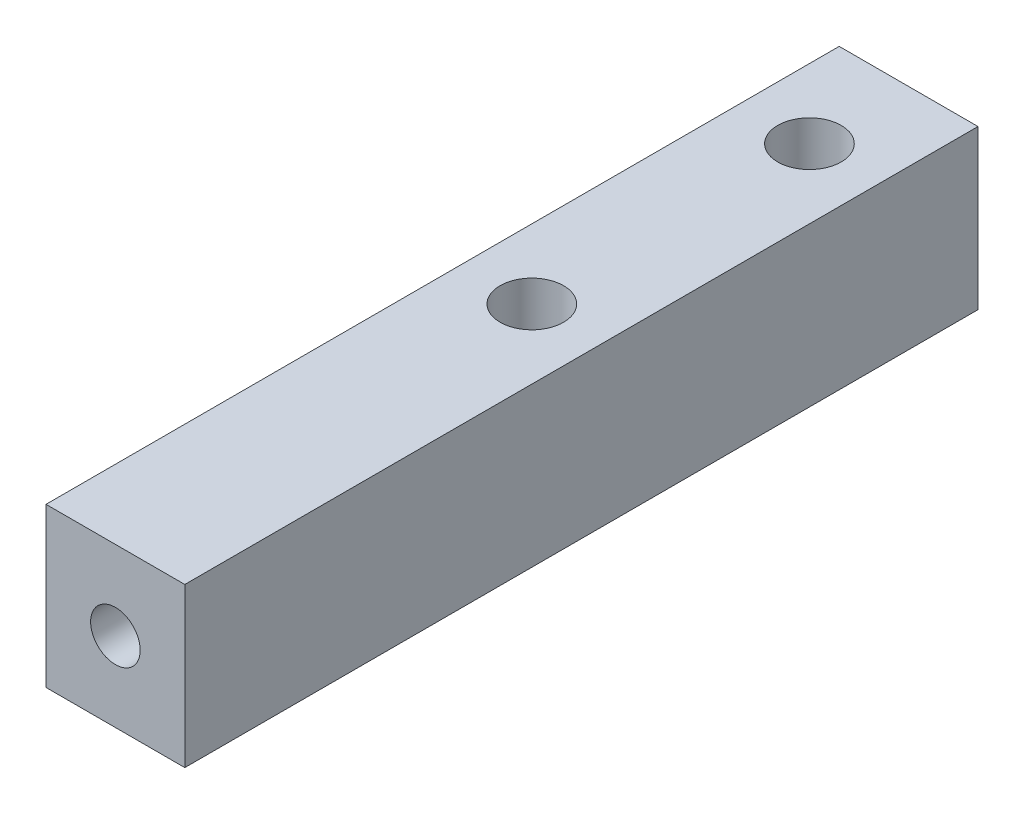
ISO-10303-21;
HEADER;
FILE_DESCRIPTION(('STEP AP214'),'2;1');
FILE_NAME('part.step','',(''),(''),'','','');
FILE_SCHEMA(('AUTOMOTIVE_DESIGN { 1 0 10303 214 1 1 1 1 }'));
ENDSEC;
DATA;
#1=APPLICATION_CONTEXT('core data for automotive mechanical design processes');
#2=APPLICATION_PROTOCOL_DEFINITION('international standard','automotive_design',2000,#1);
#3=PRODUCT_CONTEXT('',#1,'mechanical');
#4=PRODUCT('Part','Part','',(#3));
#5=PRODUCT_RELATED_PRODUCT_CATEGORY('part','',(#4));
#6=PRODUCT_DEFINITION_FORMATION('','',#4);
#7=PRODUCT_DEFINITION_CONTEXT('part definition',#1,'design');
#8=PRODUCT_DEFINITION('design','',#6,#7);
#9=PRODUCT_DEFINITION_SHAPE('','',#8);
#10=(LENGTH_UNIT() NAMED_UNIT(*) SI_UNIT(.MILLI.,.METRE.));
#11=(NAMED_UNIT(*) PLANE_ANGLE_UNIT() SI_UNIT($,.RADIAN.));
#12=(NAMED_UNIT(*) SI_UNIT($,.STERADIAN.) SOLID_ANGLE_UNIT());
#13=UNCERTAINTY_MEASURE_WITH_UNIT(LENGTH_MEASURE(1.E-05),#10,'distance_accuracy_value','');
#14=(GEOMETRIC_REPRESENTATION_CONTEXT(3) GLOBAL_UNCERTAINTY_ASSIGNED_CONTEXT((#13)) GLOBAL_UNIT_ASSIGNED_CONTEXT((#10,
#11,#12)) REPRESENTATION_CONTEXT('',''));
#15=CARTESIAN_POINT('',(0.,0.,0.));
#16=DIRECTION('',(0.,0.,1.));
#17=DIRECTION('',(1.,0.,0.));
#18=AXIS2_PLACEMENT_3D('',#15,#16,#17);
#19=CARTESIAN_POINT('',(0.,0.,40.));
#20=DIRECTION('',(1.,0.,0.));
#21=DIRECTION('',(0.,1.,0.));
#22=AXIS2_PLACEMENT_3D('',#19,#20,#21);
#23=PLANE('',#22);
#24=DIRECTION('',(0.,-1.,0.));
#25=VECTOR('',#24,1.);
#26=CARTESIAN_POINT('',(0.,0.,0.));
#27=LINE('',#26,#25);
#28=CARTESIAN_POINT('',(0.,8.,0.));
#29=VERTEX_POINT('',#28);
#30=CARTESIAN_POINT('',(0.,0.,0.));
#31=VERTEX_POINT('',#30);
#32=EDGE_CURVE('E103',#29,#31,#27,.T.);
#33=ORIENTED_EDGE('',*,*,#32,.T.);
#34=DIRECTION('',(0.,0.,-1.));
#35=VECTOR('',#34,1.);
#36=CARTESIAN_POINT('',(0.,0.,40.));
#37=LINE('',#36,#35);
#38=CARTESIAN_POINT('',(0.,0.,40.));
#39=VERTEX_POINT('',#38);
#40=EDGE_CURVE('E11',#39,#31,#37,.T.);
#41=ORIENTED_EDGE('',*,*,#40,.F.);
#42=DIRECTION('',(0.,-1.,0.));
#43=VECTOR('',#42,1.);
#44=CARTESIAN_POINT('',(0.,0.,40.));
#45=LINE('',#44,#43);
#46=CARTESIAN_POINT('',(0.,8.,40.));
#47=VERTEX_POINT('',#46);
#48=EDGE_CURVE('E114',#47,#39,#45,.T.);
#49=ORIENTED_EDGE('',*,*,#48,.F.);
#50=DIRECTION('',(0.,0.,-1.));
#51=VECTOR('',#50,1.);
#52=CARTESIAN_POINT('',(0.,8.,40.));
#53=LINE('',#52,#51);
#54=EDGE_CURVE('E119',#47,#29,#53,.T.);
#55=ORIENTED_EDGE('',*,*,#54,.T.);
#56=EDGE_LOOP('',(#33,#41,#49,#55));
#57=FACE_BOUND('',#56,.T.);
#58=ADVANCED_FACE('F36',(#57),#23,.F.);
#59=CARTESIAN_POINT('',(0.,0.,40.));
#60=DIRECTION('',(0.,1.,0.));
#61=DIRECTION('',(0.,0.,1.));
#62=AXIS2_PLACEMENT_3D('',#59,#60,#61);
#63=PLANE('',#62);
#64=CARTESIAN_POINT('',(3.5,0.,19.));
#65=DIRECTION('',(0.,1.,0.));
#66=DIRECTION('',(0.,0.,1.));
#67=AXIS2_PLACEMENT_3D('',#64,#65,#66);
#68=CIRCLE('',#67,1.59999999999999);
#69=CARTESIAN_POINT('',(3.5,0.,20.6));
#70=VERTEX_POINT('',#69);
#71=EDGE_CURVE('E131',#70,#70,#68,.T.);
#72=ORIENTED_EDGE('',*,*,#71,.T.);
#73=EDGE_LOOP('',(#72));
#74=FACE_BOUND('',#73,.T.);
#75=CARTESIAN_POINT('',(3.5,0.,5.));
#76=DIRECTION('',(0.,1.,0.));
#77=DIRECTION('',(0.,0.,1.));
#78=AXIS2_PLACEMENT_3D('',#75,#76,#77);
#79=CIRCLE('',#78,1.6);
#80=CARTESIAN_POINT('',(3.5,0.,6.6));
#81=VERTEX_POINT('',#80);
#82=EDGE_CURVE('E110',#81,#81,#79,.T.);
#83=ORIENTED_EDGE('',*,*,#82,.T.);
#84=EDGE_LOOP('',(#83));
#85=FACE_BOUND('',#84,.T.);
#86=DIRECTION('',(1.,0.,0.));
#87=VECTOR('',#86,1.);
#88=CARTESIAN_POINT('',(0.,0.,0.));
#89=LINE('',#88,#87);
#90=CARTESIAN_POINT('',(7.,0.,0.));
#91=VERTEX_POINT('',#90);
#92=EDGE_CURVE('E107',#31,#91,#89,.T.);
#93=ORIENTED_EDGE('',*,*,#92,.T.);
#94=DIRECTION('',(0.,0.,-1.));
#95=VECTOR('',#94,1.);
#96=CARTESIAN_POINT('',(7.,0.,40.));
#97=LINE('',#96,#95);
#98=CARTESIAN_POINT('',(7.,0.,40.));
#99=VERTEX_POINT('',#98);
#100=EDGE_CURVE('E49',#99,#91,#97,.T.);
#101=ORIENTED_EDGE('',*,*,#100,.F.);
#102=DIRECTION('',(1.,0.,0.));
#103=VECTOR('',#102,1.);
#104=CARTESIAN_POINT('',(0.,0.,40.));
#105=LINE('',#104,#103);
#106=EDGE_CURVE('E89',#39,#99,#105,.T.);
#107=ORIENTED_EDGE('',*,*,#106,.F.);
#108=ORIENTED_EDGE('',*,*,#40,.T.);
#109=EDGE_LOOP('',(#93,#101,#107,#108));
#110=FACE_BOUND('',#109,.T.);
#111=ADVANCED_FACE('F150',(#74,#85,#110),#63,.F.);
#112=CARTESIAN_POINT('',(7.,0.,40.));
#113=DIRECTION('',(-1.,0.,0.));
#114=DIRECTION('',(0.,-1.,0.));
#115=AXIS2_PLACEMENT_3D('',#112,#113,#114);
#116=PLANE('',#115);
#117=DIRECTION('',(0.,1.,0.));
#118=VECTOR('',#117,1.);
#119=CARTESIAN_POINT('',(7.,0.,0.));
#120=LINE('',#119,#118);
#121=CARTESIAN_POINT('',(7.,8.,0.));
#122=VERTEX_POINT('',#121);
#123=EDGE_CURVE('E76',#91,#122,#120,.T.);
#124=ORIENTED_EDGE('',*,*,#123,.T.);
#125=DIRECTION('',(0.,0.,-1.));
#126=VECTOR('',#125,1.);
#127=CARTESIAN_POINT('',(7.,8.,40.));
#128=LINE('',#127,#126);
#129=CARTESIAN_POINT('',(7.,8.,40.));
#130=VERTEX_POINT('',#129);
#131=EDGE_CURVE('E125',#130,#122,#128,.T.);
#132=ORIENTED_EDGE('',*,*,#131,.F.);
#133=DIRECTION('',(0.,1.,0.));
#134=VECTOR('',#133,1.);
#135=CARTESIAN_POINT('',(7.,0.,40.));
#136=LINE('',#135,#134);
#137=EDGE_CURVE('E117',#99,#130,#136,.T.);
#138=ORIENTED_EDGE('',*,*,#137,.F.);
#139=ORIENTED_EDGE('',*,*,#100,.T.);
#140=EDGE_LOOP('',(#124,#132,#138,#139));
#141=FACE_BOUND('',#140,.T.);
#142=ADVANCED_FACE('F155',(#141),#116,.F.);
#143=CARTESIAN_POINT('',(0.,8.,40.));
#144=DIRECTION('',(0.,-1.,0.));
#145=DIRECTION('',(0.,0.,-1.));
#146=AXIS2_PLACEMENT_3D('',#143,#144,#145);
#147=PLANE('',#146);
#148=CARTESIAN_POINT('',(3.5,8.,19.));
#149=DIRECTION('',(0.,1.,0.));
#150=DIRECTION('',(0.,0.,1.));
#151=AXIS2_PLACEMENT_3D('',#148,#149,#150);
#152=CIRCLE('',#151,1.59999999999999);
#153=CARTESIAN_POINT('',(3.5,8.,20.6));
#154=VERTEX_POINT('',#153);
#155=EDGE_CURVE('E240',#154,#154,#152,.T.);
#156=ORIENTED_EDGE('',*,*,#155,.F.);
#157=EDGE_LOOP('',(#156));
#158=FACE_BOUND('',#157,.T.);
#159=CARTESIAN_POINT('',(3.5,8.,5.));
#160=DIRECTION('',(0.,1.,0.));
#161=DIRECTION('',(0.,0.,1.));
#162=AXIS2_PLACEMENT_3D('',#159,#160,#161);
#163=CIRCLE('',#162,1.6);
#164=CARTESIAN_POINT('',(3.5,8.,6.6));
#165=VERTEX_POINT('',#164);
#166=EDGE_CURVE('E234',#165,#165,#163,.T.);
#167=ORIENTED_EDGE('',*,*,#166,.F.);
#168=EDGE_LOOP('',(#167));
#169=FACE_BOUND('',#168,.T.);
#170=DIRECTION('',(-1.,0.,0.));
#171=VECTOR('',#170,1.);
#172=CARTESIAN_POINT('',(0.,8.,0.));
#173=LINE('',#172,#171);
#174=EDGE_CURVE('E82',#122,#29,#173,.T.);
#175=ORIENTED_EDGE('',*,*,#174,.T.);
#176=ORIENTED_EDGE('',*,*,#54,.F.);
#177=DIRECTION('',(-1.,0.,0.));
#178=VECTOR('',#177,1.);
#179=CARTESIAN_POINT('',(0.,8.,40.));
#180=LINE('',#179,#178);
#181=EDGE_CURVE('E58',#130,#47,#180,.T.);
#182=ORIENTED_EDGE('',*,*,#181,.F.);
#183=ORIENTED_EDGE('',*,*,#131,.T.);
#184=EDGE_LOOP('',(#175,#176,#182,#183));
#185=FACE_BOUND('',#184,.T.);
#186=ADVANCED_FACE('F164',(#158,#169,#185),#147,.F.);
#187=CARTESIAN_POINT('',(0.,0.,40.));
#188=DIRECTION('',(0.,0.,-1.));
#189=DIRECTION('',(-1.,0.,0.));
#190=AXIS2_PLACEMENT_3D('',#187,#188,#189);
#191=PLANE('',#190);
#192=CARTESIAN_POINT('',(3.5,4.,40.));
#193=DIRECTION('',(0.,0.,1.));
#194=DIRECTION('',(1.,0.,0.));
#195=AXIS2_PLACEMENT_3D('',#192,#193,#194);
#196=CIRCLE('',#195,1.24999999999999);
#197=CARTESIAN_POINT('',(4.74999999999999,4.,40.));
#198=VERTEX_POINT('',#197);
#199=EDGE_CURVE('E104',#198,#198,#196,.T.);
#200=ORIENTED_EDGE('',*,*,#199,.F.);
#201=EDGE_LOOP('',(#200));
#202=FACE_BOUND('',#201,.T.);
#203=ORIENTED_EDGE('',*,*,#48,.T.);
#204=ORIENTED_EDGE('',*,*,#106,.T.);
#205=ORIENTED_EDGE('',*,*,#137,.T.);
#206=ORIENTED_EDGE('',*,*,#181,.T.);
#207=EDGE_LOOP('',(#203,#204,#205,#206));
#208=FACE_BOUND('',#207,.T.);
#209=ADVANCED_FACE('F162',(#202,#208),#191,.F.);
#210=CARTESIAN_POINT('',(0.,0.,0.));
#211=DIRECTION('',(0.,0.,-1.));
#212=DIRECTION('',(-1.,0.,0.));
#213=AXIS2_PLACEMENT_3D('',#210,#211,#212);
#214=PLANE('',#213);
#215=ORIENTED_EDGE('',*,*,#32,.F.);
#216=ORIENTED_EDGE('',*,*,#174,.F.);
#217=ORIENTED_EDGE('',*,*,#123,.F.);
#218=ORIENTED_EDGE('',*,*,#92,.F.);
#219=EDGE_LOOP('',(#215,#216,#217,#218));
#220=FACE_BOUND('',#219,.T.);
#221=ADVANCED_FACE('F145',(#220),#214,.T.);
#222=CARTESIAN_POINT('',(3.5,4.,40.));
#223=DIRECTION('',(0.,0.,1.));
#224=DIRECTION('',(1.,0.,0.));
#225=AXIS2_PLACEMENT_3D('',#222,#223,#224);
#226=CYLINDRICAL_SURFACE('',#225,1.24999999999998);
#227=CARTESIAN_POINT('',(4.74999999999998,4.,19.9987492177719));
#228=CARTESIAN_POINT('',(4.74999905834347,3.94277264857878,19.99875126594));
#229=CARTESIAN_POINT('',(4.7460206912253,3.88554133434749,20.0037895333303));
#230=CARTESIAN_POINT('',(4.73061486703399,3.77346523580345,20.0226053436358));
#231=CARTESIAN_POINT('',(4.71915588792606,3.71863160290557,20.0364198615448));
#232=CARTESIAN_POINT('',(4.68649982329251,3.60094587776204,20.073755770139));
#233=CARTESIAN_POINT('',(4.66370069342188,3.53903352197925,20.0987550336182));
#234=CARTESIAN_POINT('',(4.60979033563244,3.42114026043416,20.1531860293846));
#235=CARTESIAN_POINT('',(4.57866947395732,3.36516633494094,20.1826228815613));
#236=CARTESIAN_POINT('',(4.50774651870661,3.25756416366948,20.2436644502534));
#237=CARTESIAN_POINT('',(4.46772446225539,3.20610287120465,20.2753068838967));
#238=CARTESIAN_POINT('',(4.37981362614421,3.10967534406935,20.3374699939015));
#239=CARTESIAN_POINT('',(4.33193074436396,3.06470428703142,20.3679914904375));
#240=CARTESIAN_POINT('',(4.23081316825098,2.98392677380107,20.4244695284012));
#241=CARTESIAN_POINT('',(4.1779199341312,2.94779704540854,20.4505703709265));
#242=CARTESIAN_POINT('',(4.06556534785833,2.88339121161827,20.4979452513442));
#243=CARTESIAN_POINT('',(4.00611034569166,2.85510760488701,20.5192238959399));
#244=CARTESIAN_POINT('',(3.89128397905924,2.81148543843634,20.5523851173472));
#245=CARTESIAN_POINT('',(3.83669006025766,2.79482522222786,20.565209301113));
#246=CARTESIAN_POINT('',(3.72474539873686,2.76903228734458,20.5851542072672));
#247=CARTESIAN_POINT('',(3.66739647953748,2.75989466022647,20.5922786486169));
#248=CARTESIAN_POINT('',(3.55136434702235,2.74969498714826,20.6002350511513));
#249=CARTESIAN_POINT('',(3.49267762905087,2.74865739741446,20.6010479560426));
#250=CARTESIAN_POINT('',(3.37600025053518,2.75479408494118,20.5962562992692));
#251=CARTESIAN_POINT('',(3.31800968239315,2.7619694404159,20.5906508949941));
#252=CARTESIAN_POINT('',(3.20707028780574,2.78355351637801,20.5739118524586));
#253=CARTESIAN_POINT('',(3.15401218810584,2.79761603874161,20.5630430572395));
#254=CARTESIAN_POINT('',(3.05122809224261,2.83207659944447,20.5366919297513));
#255=CARTESIAN_POINT('',(3.00150288795745,2.85247613698304,20.5212085057972));
#256=CARTESIAN_POINT('',(2.90118080521289,2.90120971742196,20.4847729469328));
#257=CARTESIAN_POINT('',(2.85102411787677,2.93014556422365,20.4634212071875));
#258=CARTESIAN_POINT('',(2.75613496465724,2.99380188704757,20.4175498418317));
#259=CARTESIAN_POINT('',(2.71140625417985,3.02852632898923,20.3930280469365));
#260=CARTESIAN_POINT('',(2.61902263264094,3.11064995398226,20.3369227709444));
#261=CARTESIAN_POINT('',(2.57263675186475,3.15918924636873,20.3049200793009));
#262=CARTESIAN_POINT('',(2.48820266919998,3.26294629156026,20.2405968117025));
#263=CARTESIAN_POINT('',(2.45016217556052,3.31817014615378,20.2082759704325));
#264=CARTESIAN_POINT('',(2.38795571136045,3.42629431248143,20.1510275976312));
#265=CARTESIAN_POINT('',(2.36256188013346,3.47828530221923,20.1257207918353));
#266=CARTESIAN_POINT('',(2.31874932286463,3.58700494559874,20.0796549739323));
#267=CARTESIAN_POINT('',(2.30031508682184,3.64372271645399,20.0588858932277));
#268=CARTESIAN_POINT('',(2.27515761390896,3.74643408616934,20.029581449128));
#269=CARTESIAN_POINT('',(2.26664627350971,3.79147044501236,20.0192766529645));
#270=CARTESIAN_POINT('',(2.25462244664553,3.88312016388621,20.0045541766943));
#271=CARTESIAN_POINT('',(2.25110070906747,3.92973044096572,20.0001256025836));
#272=CARTESIAN_POINT('',(2.24933910484537,4.02337722146857,19.9979231668751));
#273=CARTESIAN_POINT('',(2.2511172281175,4.07041463505796,20.0001719709581));
#274=CARTESIAN_POINT('',(2.25983071817336,4.16329436556399,20.0109520583664));
#275=CARTESIAN_POINT('',(2.26677390592902,4.20913476087615,20.0194928688958));
#276=CARTESIAN_POINT('',(2.28820527173731,4.31247418164623,20.0449417012215));
#277=CARTESIAN_POINT('',(2.30436642845079,4.36917552741055,20.0636239922567));
#278=CARTESIAN_POINT('',(2.34359213013531,4.47811495271385,20.1061458242193));
#279=CARTESIAN_POINT('',(2.36667769940151,4.53033880749291,20.1300010093825));
#280=CARTESIAN_POINT('',(2.42892888913506,4.6491123435172,20.1896610900086));
#281=CARTESIAN_POINT('',(2.47087574479836,4.71364383398316,20.22658135515));
#282=CARTESIAN_POINT('',(2.56577500047187,4.83401882643506,20.3003257849532));
#283=CARTESIAN_POINT('',(2.61872351385841,4.88986538445129,20.3371499789153));
#284=CARTESIAN_POINT('',(2.72593208549662,4.98363234040994,20.401454364487));
#285=CARTESIAN_POINT('',(2.77859951603533,5.02299121054839,20.4294831827744));
#286=CARTESIAN_POINT('',(2.89108980097825,5.09367445299914,20.4808902524295));
#287=CARTESIAN_POINT('',(2.95090073339635,5.12501194504016,20.504276083603));
#288=CARTESIAN_POINT('',(3.06607240325555,5.17363795347101,20.5410123803031));
#289=CARTESIAN_POINT('',(3.12047709948836,5.19240568683843,20.5553908815316));
#290=CARTESIAN_POINT('',(3.2324852353464,5.2224115458891,20.5785112018954));
#291=CARTESIAN_POINT('',(3.29008686943903,5.23365387575962,20.5872561681923));
#292=CARTESIAN_POINT('',(3.4071466557595,5.24794490288962,20.5983885853756));
#293=CARTESIAN_POINT('',(3.46661105718711,5.25096214900654,20.6007516327093));
#294=CARTESIAN_POINT('',(3.58525394483713,5.24849979741203,20.5988280305604));
#295=CARTESIAN_POINT('',(3.64443243458605,5.24302030477151,20.5945414633072));
#296=CARTESIAN_POINT('',(3.75704961729387,5.22453406409656,20.5801749502428));
#297=CARTESIAN_POINT('',(3.81061767478618,5.21200992370078,20.5704667059589));
#298=CARTESIAN_POINT('',(3.91465091922058,5.18047528374455,20.5462600173792));
#299=CARTESIAN_POINT('',(3.96511536524311,5.16146324237867,20.5317604344804));
#300=CARTESIAN_POINT('',(4.06634403327663,5.11584068422013,20.4974492763375));
#301=CARTESIAN_POINT('',(4.11675370272086,5.08871367729768,20.4772857440147));
#302=CARTESIAN_POINT('',(4.21239846816129,5.02867965220246,20.4336169530699));
#303=CARTESIAN_POINT('',(4.25763061775158,4.99576936964203,20.4101098085716));
#304=CARTESIAN_POINT('',(4.35109544944769,4.91789767306313,20.3561320381931));
#305=CARTESIAN_POINT('',(4.39814942864525,4.8718403186449,20.3252041427369));
#306=CARTESIAN_POINT('',(4.48432348754309,4.77324196924655,20.2625160356888));
#307=CARTESIAN_POINT('',(4.52343520380839,4.72069423235873,20.2307549860817));
#308=CARTESIAN_POINT('',(4.59061234236973,4.61378314211901,20.1714975027623));
#309=CARTESIAN_POINT('',(4.61930763069455,4.55989389582086,20.1438625899276));
#310=CARTESIAN_POINT('',(4.66907362083411,4.44673973555381,20.0929456842123));
#311=CARTESIAN_POINT('',(4.69015354760203,4.38748143508208,20.0696584413771));
#312=CARTESIAN_POINT('',(4.72077179261694,4.27399573730862,20.0344929257376));
#313=CARTESIAN_POINT('',(4.7316343613194,4.22053209334563,20.0213712262882));
#314=CARTESIAN_POINT('',(4.74623538659023,4.11137401153205,20.0035143085403));
#315=CARTESIAN_POINT('',(4.75000091634151,4.05568888206901,19.9987472246657));
#316=CARTESIAN_POINT('',(4.74999999999998,4.,19.9987492177719));
#317=B_SPLINE_CURVE_WITH_KNOTS('',3,(#227,#228,#229,#230,#231,#232,#233,#234,#235,#236,#237,
#238,#239,#240,#241,#242,#243,#244,#245,#246,#247,#248,#249,#250,#251,#252,#253,#254,#255,#256,
#257,#258,#259,#260,#261,#262,#263,#264,#265,#266,#267,#268,#269,#270,#271,#272,#273,#274,#275,
#276,#277,#278,#279,#280,#281,#282,#283,#284,#285,#286,#287,#288,#289,#290,#291,#292,#293,#294,
#295,#296,#297,#298,#299,#300,#301,#302,#303,#304,#305,#306,#307,#308,#309,#310,#311,#312,#313,
#314,#315,#316),.UNSPECIFIED.,.T.,.F.,(4,2,2,2,2,2,2,2,2,2,2,2,2,2,2,2,2,2,2,2,2,2,2,2,2,2,2,2,
2,2,2,2,2,2,2,2,2,2,2,2,2,2,2,2,4),(0.,0.17138546358477,0.343497819134043,0.554002024871383,
0.764750986433626,0.981440047044847,1.19796726539999,1.40466875512032,1.61117194012662,
1.78592752284092,1.96056898802944,2.1357375403598,2.31092909185542,2.47810000769835,
2.64531050268504,2.82978713315131,3.01439067683289,3.23670805376962,3.45922991844445,
3.64813520662834,3.83661698405495,3.97699626576425,4.11711493119149,4.25770975827702,
4.3985179093457,4.58303191093616,4.7681119152193,5.02294123801546,5.2776806882801,
5.49128252775348,5.70453273588054,5.88174549683135,6.05885917222078,6.23664915260007,
6.4144369344411,6.5813133881797,6.74822952661843,6.9296411231379,7.11115544884169,
7.32860385459188,7.54628006583591,7.74670135855687,7.9468790481141,8.11429703185944,
8.28107506077194),.UNSPECIFIED.);
#318=CARTESIAN_POINT('',(4.74999999999998,4.,19.9987492177719));
#319=VERTEX_POINT('',#318);
#320=EDGE_CURVE('E127',#319,#319,#317,.T.);
#321=ORIENTED_EDGE('',*,*,#320,.T.);
#322=EDGE_LOOP('',(#321));
#323=FACE_BOUND('',#322,.T.);
#324=ORIENTED_EDGE('',*,*,#199,.T.);
#325=EDGE_LOOP('',(#324));
#326=FACE_BOUND('',#325,.T.);
#327=ADVANCED_FACE('F132',(#323,#326),#226,.F.);
#328=CARTESIAN_POINT('',(3.5,0.,5.));
#329=DIRECTION('',(0.,1.,0.));
#330=DIRECTION('',(0.,0.,1.));
#331=AXIS2_PLACEMENT_3D('',#328,#329,#330);
#332=CYLINDRICAL_SURFACE('',#331,1.6);
#333=ORIENTED_EDGE('',*,*,#82,.F.);
#334=EDGE_LOOP('',(#333));
#335=FACE_BOUND('',#334,.T.);
#336=ORIENTED_EDGE('',*,*,#166,.T.);
#337=EDGE_LOOP('',(#336));
#338=FACE_BOUND('',#337,.T.);
#339=ADVANCED_FACE('F137',(#335,#338),#332,.F.);
#340=CARTESIAN_POINT('',(3.5,0.,19.));
#341=DIRECTION('',(0.,1.,0.));
#342=DIRECTION('',(0.,0.,1.));
#343=AXIS2_PLACEMENT_3D('',#340,#341,#342);
#344=CYLINDRICAL_SURFACE('',#343,1.59999999999999);
#345=ORIENTED_EDGE('',*,*,#320,.F.);
#346=EDGE_LOOP('',(#345));
#347=FACE_BOUND('',#346,.T.);
#348=ORIENTED_EDGE('',*,*,#71,.F.);
#349=EDGE_LOOP('',(#348));
#350=FACE_BOUND('',#349,.T.);
#351=ORIENTED_EDGE('',*,*,#155,.T.);
#352=EDGE_LOOP('',(#351));
#353=FACE_BOUND('',#352,.T.);
#354=CARTESIAN_POINT('',(4.74999999999998,4.,18.0012507822281));
#355=CARTESIAN_POINT('',(4.74999905834347,4.05722735142122,18.00124873406));
#356=CARTESIAN_POINT('',(4.7460206912253,4.11445866565251,17.9962104666696));
#357=CARTESIAN_POINT('',(4.73061486703399,4.22653476419655,17.9773946563642));
#358=CARTESIAN_POINT('',(4.71915588792606,4.28136839709443,17.9635801384552));
#359=CARTESIAN_POINT('',(4.68649982329251,4.39905412223796,17.926244229861));
#360=CARTESIAN_POINT('',(4.66370069342188,4.46096647802075,17.9012449663818));
#361=CARTESIAN_POINT('',(4.60979033563244,4.57885973956584,17.8468139706154));
#362=CARTESIAN_POINT('',(4.57866947395732,4.63483366505906,17.8173771184387));
#363=CARTESIAN_POINT('',(4.50774651870661,4.74243583633052,17.7563355497465));
#364=CARTESIAN_POINT('',(4.46772446225539,4.79389712879535,17.7246931161033));
#365=CARTESIAN_POINT('',(4.37981362614421,4.89032465593065,17.6625300060985));
#366=CARTESIAN_POINT('',(4.33193074436396,4.93529571296858,17.6320085095625));
#367=CARTESIAN_POINT('',(4.23081316825098,5.01607322619893,17.5755304715988));
#368=CARTESIAN_POINT('',(4.1779199341312,5.05220295459147,17.5494296290735));
#369=CARTESIAN_POINT('',(4.06556534785833,5.11660878838173,17.5020547486558));
#370=CARTESIAN_POINT('',(4.00611034569166,5.14489239511299,17.4807761040601));
#371=CARTESIAN_POINT('',(3.89128397905924,5.18851456156366,17.4476148826528));
#372=CARTESIAN_POINT('',(3.83669006025766,5.20517477777214,17.434790698887));
#373=CARTESIAN_POINT('',(3.72474539873686,5.23096771265542,17.4148457927328));
#374=CARTESIAN_POINT('',(3.66739647953748,5.24010533977353,17.4077213513831));
#375=CARTESIAN_POINT('',(3.55136434702235,5.25030501285174,17.3997649488487));
#376=CARTESIAN_POINT('',(3.49267762905087,5.25134260258554,17.3989520439574));
#377=CARTESIAN_POINT('',(3.37600025053518,5.24520591505882,17.4037437007308));
#378=CARTESIAN_POINT('',(3.31800968239315,5.2380305595841,17.4093491050059));
#379=CARTESIAN_POINT('',(3.20707028780574,5.21644648362199,17.4260881475414));
#380=CARTESIAN_POINT('',(3.15401218810584,5.20238396125839,17.4369569427605));
#381=CARTESIAN_POINT('',(3.05122809224261,5.16792340055553,17.4633080702487));
#382=CARTESIAN_POINT('',(3.00150288795744,5.14752386301696,17.4787914942028));
#383=CARTESIAN_POINT('',(2.90118080521289,5.09879028257804,17.5152270530672));
#384=CARTESIAN_POINT('',(2.85102411787677,5.06985443577635,17.5365787928124));
#385=CARTESIAN_POINT('',(2.75613496465724,5.00619811295243,17.5824501581683));
#386=CARTESIAN_POINT('',(2.71140625417985,4.97147367101077,17.6069719530635));
#387=CARTESIAN_POINT('',(2.61902263264094,4.88935004601774,17.6630772290556));
#388=CARTESIAN_POINT('',(2.57263675186475,4.84081075363127,17.6950799206991));
#389=CARTESIAN_POINT('',(2.48820266919998,4.73705370843974,17.7594031882975));
#390=CARTESIAN_POINT('',(2.45016217556052,4.68182985384622,17.7917240295675));
#391=CARTESIAN_POINT('',(2.38795571136045,4.57370568751857,17.8489724023688));
#392=CARTESIAN_POINT('',(2.36256188013346,4.52171469778077,17.8742792081647));
#393=CARTESIAN_POINT('',(2.31874932286463,4.41299505440126,17.9203450260677));
#394=CARTESIAN_POINT('',(2.30031508682184,4.35627728354601,17.9411141067723));
#395=CARTESIAN_POINT('',(2.27515761390896,4.25356591383066,17.970418550872));
#396=CARTESIAN_POINT('',(2.26664627350971,4.20852955498764,17.9807233470355));
#397=CARTESIAN_POINT('',(2.25462244664553,4.11687983611379,17.9954458233057));
#398=CARTESIAN_POINT('',(2.25110070906747,4.07026955903428,17.9998743974164));
#399=CARTESIAN_POINT('',(2.24933910484537,3.97662277853143,18.0020768331249));
#400=CARTESIAN_POINT('',(2.2511172281175,3.92958536494204,17.9998280290419));
#401=CARTESIAN_POINT('',(2.25983071817337,3.83670563443601,17.9890479416336));
#402=CARTESIAN_POINT('',(2.26677390592902,3.79086523912385,17.9805071311042));
#403=CARTESIAN_POINT('',(2.28820527173731,3.68752581835377,17.9550582987785));
#404=CARTESIAN_POINT('',(2.30436642845079,3.63082447258944,17.9363760077433));
#405=CARTESIAN_POINT('',(2.34359213013531,3.52188504728615,17.8938541757807));
#406=CARTESIAN_POINT('',(2.36667769940151,3.46966119250709,17.8699989906175));
#407=CARTESIAN_POINT('',(2.42892888913506,3.3508876564828,17.8103389099914));
#408=CARTESIAN_POINT('',(2.47087574479836,3.28635616601684,17.77341864485));
#409=CARTESIAN_POINT('',(2.56577500047187,3.16598117356493,17.6996742150468));
#410=CARTESIAN_POINT('',(2.61872351385842,3.11013461554871,17.6628500210847));
#411=CARTESIAN_POINT('',(2.72593208549662,3.01636765959006,17.598545635513));
#412=CARTESIAN_POINT('',(2.77859951603534,2.97700878945161,17.5705168172256));
#413=CARTESIAN_POINT('',(2.89108980097825,2.90632554700086,17.5191097475705));
#414=CARTESIAN_POINT('',(2.95090073339635,2.87498805495984,17.495723916397));
#415=CARTESIAN_POINT('',(3.06607240325556,2.82636204652899,17.4589876196969));
#416=CARTESIAN_POINT('',(3.12047709948837,2.80759431316157,17.4446091184684));
#417=CARTESIAN_POINT('',(3.2324852353464,2.7775884541109,17.4214887981046));
#418=CARTESIAN_POINT('',(3.29008686943904,2.76634612424038,17.4127438318076));
#419=CARTESIAN_POINT('',(3.40714665575951,2.75205509711038,17.4016114146244));
#420=CARTESIAN_POINT('',(3.46661105718711,2.74903785099346,17.3992483672907));
#421=CARTESIAN_POINT('',(3.58525394483713,2.75150020258797,17.4011719694396));
#422=CARTESIAN_POINT('',(3.64443243458606,2.7569796952285,17.4054585366928));
#423=CARTESIAN_POINT('',(3.75704961729387,2.77546593590344,17.4198250497572));
#424=CARTESIAN_POINT('',(3.81061767478619,2.78799007629922,17.4295332940411));
#425=CARTESIAN_POINT('',(3.91465091922059,2.81952471625545,17.4537399826208));
#426=CARTESIAN_POINT('',(3.96511536524311,2.83853675762133,17.4682395655196));
#427=CARTESIAN_POINT('',(4.06634403327663,2.88415931577987,17.5025507236624));
#428=CARTESIAN_POINT('',(4.11675370272086,2.91128632270232,17.5227142559853));
#429=CARTESIAN_POINT('',(4.21239846816129,2.97132034779754,17.5663830469301));
#430=CARTESIAN_POINT('',(4.25763061775158,3.00423063035798,17.5898901914284));
#431=CARTESIAN_POINT('',(4.35109544944769,3.08210232693687,17.6438679618069));
#432=CARTESIAN_POINT('',(4.39814942864525,3.1281596813551,17.6747958572631));
#433=CARTESIAN_POINT('',(4.48432348754309,3.22675803075345,17.7374839643112));
#434=CARTESIAN_POINT('',(4.52343520380839,3.27930576764128,17.7692450139183));
#435=CARTESIAN_POINT('',(4.59061234236973,3.38621685788099,17.8285024972377));
#436=CARTESIAN_POINT('',(4.61930763069455,3.44010610417914,17.8561374100724));
#437=CARTESIAN_POINT('',(4.66907362083411,3.5532602644462,17.9070543157877));
#438=CARTESIAN_POINT('',(4.69015354760203,3.61251856491792,17.9303415586229));
#439=CARTESIAN_POINT('',(4.72077179261694,3.72600426269138,17.9655070742624));
#440=CARTESIAN_POINT('',(4.7316343613194,3.77946790665437,17.9786287737118));
#441=CARTESIAN_POINT('',(4.74623538659023,3.88862598846795,17.9964856914597));
#442=CARTESIAN_POINT('',(4.75000091634151,3.944311117931,18.0012527753343));
#443=CARTESIAN_POINT('',(4.74999999999998,4.,18.0012507822281));
#444=B_SPLINE_CURVE_WITH_KNOTS('',3,(#354,#355,#356,#357,#358,#359,#360,#361,#362,#363,#364,
#365,#366,#367,#368,#369,#370,#371,#372,#373,#374,#375,#376,#377,#378,#379,#380,#381,#382,#383,
#384,#385,#386,#387,#388,#389,#390,#391,#392,#393,#394,#395,#396,#397,#398,#399,#400,#401,#402,
#403,#404,#405,#406,#407,#408,#409,#410,#411,#412,#413,#414,#415,#416,#417,#418,#419,#420,#421,
#422,#423,#424,#425,#426,#427,#428,#429,#430,#431,#432,#433,#434,#435,#436,#437,#438,#439,#440,
#441,#442,#443),.UNSPECIFIED.,.T.,.F.,(4,2,2,2,2,2,2,2,2,2,2,2,2,2,2,2,2,2,2,2,2,2,2,2,2,2,2,2,
2,2,2,2,2,2,2,2,2,2,2,2,2,2,2,2,4),(0.,0.17138546358477,0.343497819134043,0.554002024871384,
0.764750986433626,0.981440047044847,1.19796726539999,1.40466875512032,1.61117194012662,
1.78592752284092,1.96056898802944,2.1357375403598,2.31092909185542,2.47810000769835,
2.64531050268504,2.82978713315132,3.0143906768329,3.23670805376962,3.45922991844445,
3.64813520662834,3.83661698405495,3.97699626576425,4.11711493119149,4.25770975827702,
4.3985179093457,4.58303191093616,4.7681119152193,5.02294123801546,5.2776806882801,
5.49128252775349,5.70453273588055,5.88174549683136,6.05885917222079,6.23664915260007,
6.41443693444111,6.5813133881797,6.74822952661844,6.92964112313791,7.1111554488417,
7.32860385459189,7.54628006583592,7.74670135855687,7.94687904811411,8.11429703185945,
8.28107506077194),.UNSPECIFIED.);
#445=CARTESIAN_POINT('',(4.74999999999998,4.,18.0012507822281));
#446=VERTEX_POINT('',#445);
#447=EDGE_CURVE('E39',#446,#446,#444,.T.);
#448=ORIENTED_EDGE('',*,*,#447,.F.);
#449=EDGE_LOOP('',(#448));
#450=FACE_BOUND('',#449,.T.);
#451=ADVANCED_FACE('F97',(#347,#350,#353,#450),#344,.F.);
#452=CARTESIAN_POINT('',(3.5,4.,10.));
#453=DIRECTION('',(0.,0.,1.));
#454=DIRECTION('',(1.,0.,0.));
#455=AXIS2_PLACEMENT_3D('',#452,#453,#454);
#456=CONICAL_SURFACE('',#455,1.24999999999998,1.02974425867665);
#457=CARTESIAN_POINT('',(3.49999999999999,4.,9.24892422621556));
#458=VERTEX_POINT('',#457);
#459=VERTEX_LOOP('',#458);
#460=FACE_BOUND('',#459,.T.);
#461=CARTESIAN_POINT('',(3.5,4.,10.));
#462=DIRECTION('',(0.,0.,1.));
#463=DIRECTION('',(1.,0.,0.));
#464=AXIS2_PLACEMENT_3D('',#461,#462,#463);
#465=CIRCLE('',#464,1.24999999999998);
#466=CARTESIAN_POINT('',(4.74999999999998,4.,10.));
#467=VERTEX_POINT('',#466);
#468=EDGE_CURVE('E101',#467,#467,#465,.T.);
#469=ORIENTED_EDGE('',*,*,#468,.T.);
#470=EDGE_LOOP('',(#469));
#471=FACE_BOUND('',#470,.T.);
#472=ADVANCED_FACE('F93',(#460,#471),#456,.F.);
#473=ORIENTED_EDGE('',*,*,#447,.T.);
#474=EDGE_LOOP('',(#473));
#475=FACE_BOUND('',#474,.T.);
#476=ORIENTED_EDGE('',*,*,#468,.F.);
#477=EDGE_LOOP('',(#476));
#478=FACE_BOUND('',#477,.T.);
#479=ADVANCED_FACE('F96',(#475,#478),#226,.F.);
#480=CLOSED_SHELL('',(#58,#111,#142,#186,#209,#221,#327,#339,#451,#472,#479));
#481=MANIFOLD_SOLID_BREP('B2',#480);
#482=ADVANCED_BREP_SHAPE_REPRESENTATION('',(#18,#481),#14);
#483=SHAPE_DEFINITION_REPRESENTATION(#9,#482);
ENDSEC;
END-ISO-10303-21;
